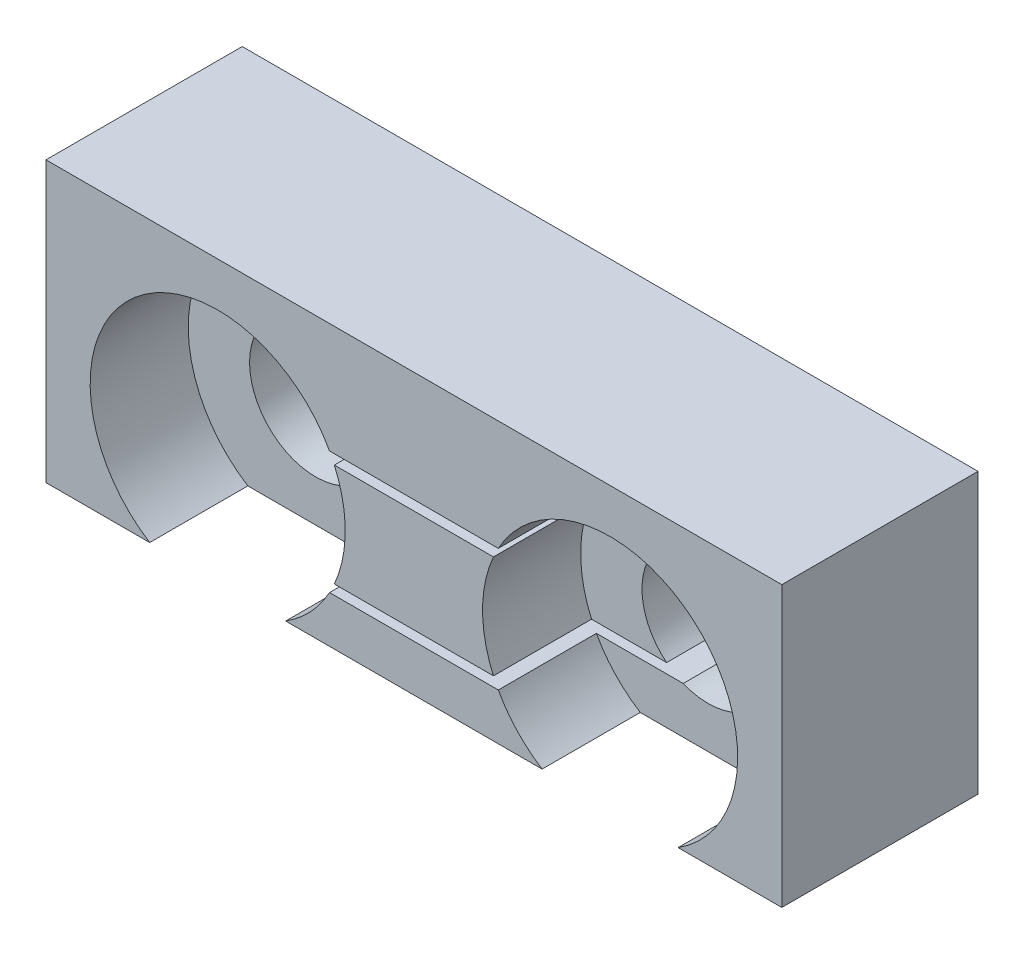
ISO-10303-21;
HEADER;
FILE_DESCRIPTION(('STEP AP214'),'2;1');
FILE_NAME('part.step','',(''),(''),'','','');
FILE_SCHEMA(('AUTOMOTIVE_DESIGN { 1 0 10303 214 1 1 1 1 }'));
ENDSEC;
DATA;
#1=APPLICATION_CONTEXT('core data for automotive mechanical design processes');
#2=APPLICATION_PROTOCOL_DEFINITION('international standard','automotive_design',2000,#1);
#3=PRODUCT_CONTEXT('',#1,'mechanical');
#4=PRODUCT('Part','Part','',(#3));
#5=PRODUCT_RELATED_PRODUCT_CATEGORY('part','',(#4));
#6=PRODUCT_DEFINITION_FORMATION('','',#4);
#7=PRODUCT_DEFINITION_CONTEXT('part definition',#1,'design');
#8=PRODUCT_DEFINITION('design','',#6,#7);
#9=PRODUCT_DEFINITION_SHAPE('','',#8);
#10=(LENGTH_UNIT() NAMED_UNIT(*) SI_UNIT(.MILLI.,.METRE.));
#11=(NAMED_UNIT(*) PLANE_ANGLE_UNIT() SI_UNIT($,.RADIAN.));
#12=(NAMED_UNIT(*) SI_UNIT($,.STERADIAN.) SOLID_ANGLE_UNIT());
#13=UNCERTAINTY_MEASURE_WITH_UNIT(LENGTH_MEASURE(1.E-05),#10,'distance_accuracy_value','');
#14=(GEOMETRIC_REPRESENTATION_CONTEXT(3) GLOBAL_UNCERTAINTY_ASSIGNED_CONTEXT((#13)) GLOBAL_UNIT_ASSIGNED_CONTEXT((#10,
#11,#12)) REPRESENTATION_CONTEXT('',''));
#15=CARTESIAN_POINT('',(0.,0.,0.));
#16=DIRECTION('',(0.,0.,1.));
#17=DIRECTION('',(1.,0.,0.));
#18=AXIS2_PLACEMENT_3D('',#15,#16,#17);
#19=CARTESIAN_POINT('',(0.,0.,40.));
#20=DIRECTION('',(0.,0.,-1.));
#21=DIRECTION('',(-1.,0.,0.));
#22=AXIS2_PLACEMENT_3D('',#19,#20,#21);
#23=PLANE('',#22);
#24=DIRECTION('',(1.,0.,0.));
#25=VECTOR('',#24,1.);
#26=CARTESIAN_POINT('',(-40.,-12.5,40.));
#27=LINE('',#26,#25);
#28=CARTESIAN_POINT('',(-17.201973769644,-12.5,40.));
#29=VERTEX_POINT('',#28);
#30=CARTESIAN_POINT('',(17.201973769644,-12.5,40.));
#31=VERTEX_POINT('',#30);
#32=EDGE_CURVE('E218',#29,#31,#27,.T.);
#33=ORIENTED_EDGE('',*,*,#32,.F.);
#34=CARTESIAN_POINT('',(-40.,0.,40.));
#35=DIRECTION('',(0.,0.,1.));
#36=DIRECTION('',(-1.,0.,0.));
#37=AXIS2_PLACEMENT_3D('',#34,#35,#36);
#38=CIRCLE('',#37,26.);
#39=CARTESIAN_POINT('',(-26.143593539449,-22.,40.));
#40=VERTEX_POINT('',#39);
#41=EDGE_CURVE('E355',#40,#29,#38,.T.);
#42=ORIENTED_EDGE('',*,*,#41,.F.);
#43=DIRECTION('',(-1.,0.,0.));
#44=VECTOR('',#43,1.);
#45=CARTESIAN_POINT('',(-75.,-22.,40.));
#46=LINE('',#45,#44);
#47=CARTESIAN_POINT('',(26.143593539449,-22.,40.));
#48=VERTEX_POINT('',#47);
#49=EDGE_CURVE('E253',#48,#40,#46,.T.);
#50=ORIENTED_EDGE('',*,*,#49,.F.);
#51=CARTESIAN_POINT('',(40.,0.,40.));
#52=DIRECTION('',(0.,0.,1.));
#53=DIRECTION('',(1.,0.,0.));
#54=AXIS2_PLACEMENT_3D('',#51,#52,#53);
#55=CIRCLE('',#54,26.);
#56=EDGE_CURVE('E320',#31,#48,#55,.T.);
#57=ORIENTED_EDGE('',*,*,#56,.F.);
#58=EDGE_LOOP('',(#33,#42,#50,#57));
#59=FACE_BOUND('',#58,.T.);
#60=ADVANCED_FACE('F34',(#59),#23,.F.);
#61=CARTESIAN_POINT('',(40.,0.,20.));
#62=DIRECTION('',(0.,0.,1.));
#63=DIRECTION('',(1.,0.,0.));
#64=AXIS2_PLACEMENT_3D('',#61,#62,#63);
#65=PLANE('',#64);
#66=CARTESIAN_POINT('',(40.,0.,20.));
#67=DIRECTION('',(0.,0.,1.));
#68=DIRECTION('',(1.,0.,0.));
#69=AXIS2_PLACEMENT_3D('',#66,#67,#68);
#70=CIRCLE('',#69,13.5);
#71=CARTESIAN_POINT('',(34.9009804864072,-12.5,20.));
#72=VERTEX_POINT('',#71);
#73=CARTESIAN_POINT('',(34.9009804864072,12.5,20.));
#74=VERTEX_POINT('',#73);
#75=EDGE_CURVE('E699',#72,#74,#70,.T.);
#76=ORIENTED_EDGE('',*,*,#75,.F.);
#77=DIRECTION('',(1.,0.,0.));
#78=VECTOR('',#77,1.);
#79=CARTESIAN_POINT('',(40.,-12.5,20.));
#80=LINE('',#79,#78);
#81=CARTESIAN_POINT('',(17.201973769644,-12.5,20.));
#82=VERTEX_POINT('',#81);
#83=EDGE_CURVE('E216',#82,#72,#80,.T.);
#84=ORIENTED_EDGE('',*,*,#83,.F.);
#85=CARTESIAN_POINT('',(40.,0.,20.));
#86=DIRECTION('',(0.,0.,-1.));
#87=DIRECTION('',(-1.,0.,0.));
#88=AXIS2_PLACEMENT_3D('',#85,#86,#87);
#89=CIRCLE('',#88,26.);
#90=CARTESIAN_POINT('',(26.143593539449,-22.,20.));
#91=VERTEX_POINT('',#90);
#92=EDGE_CURVE('E318',#82,#91,#89,.F.);
#93=ORIENTED_EDGE('',*,*,#92,.T.);
#94=DIRECTION('',(1.,0.,0.));
#95=VECTOR('',#94,1.);
#96=CARTESIAN_POINT('',(-75.,-22.,20.));
#97=LINE('',#96,#95);
#98=CARTESIAN_POINT('',(53.856406460551,-22.,20.));
#99=VERTEX_POINT('',#98);
#100=EDGE_CURVE('E260',#91,#99,#97,.T.);
#101=ORIENTED_EDGE('',*,*,#100,.T.);
#102=CARTESIAN_POINT('',(17.201973769644,12.5,20.));
#103=VERTEX_POINT('',#102);
#104=EDGE_CURVE('E315',#99,#103,#89,.F.);
#105=ORIENTED_EDGE('',*,*,#104,.T.);
#106=DIRECTION('',(-1.,0.,0.));
#107=VECTOR('',#106,1.);
#108=CARTESIAN_POINT('',(40.,12.5,20.));
#109=LINE('',#108,#107);
#110=EDGE_CURVE('E237',#74,#103,#109,.T.);
#111=ORIENTED_EDGE('',*,*,#110,.F.);
#112=EDGE_LOOP('',(#76,#84,#93,#101,#105,#111));
#113=FACE_BOUND('',#112,.T.);
#114=ADVANCED_FACE('F424',(#113),#65,.T.);
#115=CARTESIAN_POINT('',(-40.,0.,20.));
#116=DIRECTION('',(0.,0.,-1.));
#117=DIRECTION('',(-1.,0.,0.));
#118=AXIS2_PLACEMENT_3D('',#115,#116,#117);
#119=PLANE('',#118);
#120=DIRECTION('',(-1.,0.,0.));
#121=VECTOR('',#120,1.);
#122=CARTESIAN_POINT('',(-40.,-12.5,20.));
#123=LINE('',#122,#121);
#124=CARTESIAN_POINT('',(-17.201973769644,-12.5,20.));
#125=VERTEX_POINT('',#124);
#126=CARTESIAN_POINT('',(-34.9009804864072,-12.5,20.));
#127=VERTEX_POINT('',#126);
#128=EDGE_CURVE('E295',#125,#127,#123,.T.);
#129=ORIENTED_EDGE('',*,*,#128,.T.);
#130=CARTESIAN_POINT('',(-40.,0.,20.));
#131=DIRECTION('',(0.,0.,1.));
#132=DIRECTION('',(-1.,0.,0.));
#133=AXIS2_PLACEMENT_3D('',#130,#131,#132);
#134=CIRCLE('',#133,13.5);
#135=CARTESIAN_POINT('',(-34.9009804864072,12.5,20.));
#136=VERTEX_POINT('',#135);
#137=EDGE_CURVE('E684',#136,#127,#134,.T.);
#138=ORIENTED_EDGE('',*,*,#137,.F.);
#139=DIRECTION('',(1.,0.,0.));
#140=VECTOR('',#139,1.);
#141=CARTESIAN_POINT('',(-40.,12.5,20.));
#142=LINE('',#141,#140);
#143=CARTESIAN_POINT('',(-17.201973769644,12.5,20.));
#144=VERTEX_POINT('',#143);
#145=EDGE_CURVE('E235',#136,#144,#142,.T.);
#146=ORIENTED_EDGE('',*,*,#145,.T.);
#147=CARTESIAN_POINT('',(-40.,0.,20.));
#148=DIRECTION('',(0.,0.,-1.));
#149=DIRECTION('',(-1.,0.,0.));
#150=AXIS2_PLACEMENT_3D('',#147,#148,#149);
#151=CIRCLE('',#150,26.);
#152=CARTESIAN_POINT('',(-53.856406460551,-22.,20.));
#153=VERTEX_POINT('',#152);
#154=EDGE_CURVE('E358',#144,#153,#151,.F.);
#155=ORIENTED_EDGE('',*,*,#154,.T.);
#156=DIRECTION('',(-1.,0.,0.));
#157=VECTOR('',#156,1.);
#158=CARTESIAN_POINT('',(-75.,-22.,20.));
#159=LINE('',#158,#157);
#160=CARTESIAN_POINT('',(-26.143593539449,-22.,20.));
#161=VERTEX_POINT('',#160);
#162=EDGE_CURVE('E257',#161,#153,#159,.T.);
#163=ORIENTED_EDGE('',*,*,#162,.F.);
#164=EDGE_CURVE('E366',#161,#125,#151,.F.);
#165=ORIENTED_EDGE('',*,*,#164,.T.);
#166=EDGE_LOOP('',(#129,#138,#146,#155,#163,#165));
#167=FACE_BOUND('',#166,.T.);
#168=ADVANCED_FACE('F429',(#167),#119,.F.);
#169=DIRECTION('',(1.,0.,0.));
#170=VECTOR('',#169,1.);
#171=CARTESIAN_POINT('',(-40.,10.5,40.));
#172=LINE('',#171,#170);
#173=CARTESIAN_POINT('',(-16.2145002154674,10.5,40.));
#174=VERTEX_POINT('',#173);
#175=CARTESIAN_POINT('',(16.2145002154674,10.5,40.));
#176=VERTEX_POINT('',#175);
#177=EDGE_CURVE('E226',#174,#176,#172,.T.);
#178=ORIENTED_EDGE('',*,*,#177,.F.);
#179=CARTESIAN_POINT('',(-16.2145002154674,-10.5,40.));
#180=VERTEX_POINT('',#179);
#181=EDGE_CURVE('E351',#180,#174,#38,.T.);
#182=ORIENTED_EDGE('',*,*,#181,.F.);
#183=DIRECTION('',(-1.,0.,0.));
#184=VECTOR('',#183,1.);
#185=CARTESIAN_POINT('',(-40.,-10.5,40.));
#186=LINE('',#185,#184);
#187=CARTESIAN_POINT('',(16.2145002154674,-10.5,40.));
#188=VERTEX_POINT('',#187);
#189=EDGE_CURVE('E221',#188,#180,#186,.T.);
#190=ORIENTED_EDGE('',*,*,#189,.F.);
#191=EDGE_CURVE('E316',#176,#188,#55,.T.);
#192=ORIENTED_EDGE('',*,*,#191,.F.);
#193=EDGE_LOOP('',(#178,#182,#190,#192));
#194=FACE_BOUND('',#193,.T.);
#195=ADVANCED_FACE('F350',(#194),#23,.F.);
#196=CARTESIAN_POINT('',(40.,0.,-0.001000000000001));
#197=DIRECTION('',(0.,0.,1.));
#198=DIRECTION('',(1.,0.,0.));
#199=AXIS2_PLACEMENT_3D('',#196,#197,#198);
#200=CYLINDRICAL_SURFACE('',#199,2.75);
#201=CARTESIAN_POINT('',(40.,0.,0.));
#202=DIRECTION('',(0.,0.,-1.));
#203=DIRECTION('',(-1.,0.,0.));
#204=AXIS2_PLACEMENT_3D('',#201,#202,#203);
#205=CIRCLE('',#204,2.75);
#206=CARTESIAN_POINT('',(37.25,0.,0.));
#207=VERTEX_POINT('',#206);
#208=EDGE_CURVE('E266',#207,#207,#205,.F.);
#209=ORIENTED_EDGE('',*,*,#208,.F.);
#210=EDGE_LOOP('',(#209));
#211=FACE_BOUND('',#210,.T.);
#212=CARTESIAN_POINT('',(40.,0.,10.));
#213=DIRECTION('',(0.,0.,1.));
#214=DIRECTION('',(1.,0.,0.));
#215=AXIS2_PLACEMENT_3D('',#212,#213,#214);
#216=CIRCLE('',#215,2.75);
#217=CARTESIAN_POINT('',(42.75,0.,10.));
#218=VERTEX_POINT('',#217);
#219=EDGE_CURVE('E267',#218,#218,#216,.F.);
#220=ORIENTED_EDGE('',*,*,#219,.F.);
#221=EDGE_LOOP('',(#220));
#222=FACE_BOUND('',#221,.T.);
#223=ADVANCED_FACE('F416',(#211,#222),#200,.F.);
#224=CARTESIAN_POINT('',(75.,-35.,40.));
#225=DIRECTION('',(-1.,0.,0.));
#226=DIRECTION('',(0.,0.,1.));
#227=AXIS2_PLACEMENT_3D('',#224,#225,#226);
#228=PLANE('',#227);
#229=DIRECTION('',(0.,1.,0.));
#230=VECTOR('',#229,1.);
#231=CARTESIAN_POINT('',(75.,-35.,40.));
#232=LINE('',#231,#230);
#233=CARTESIAN_POINT('',(75.,-22.,40.));
#234=VERTEX_POINT('',#233);
#235=CARTESIAN_POINT('',(75.,35.,40.));
#236=VERTEX_POINT('',#235);
#237=EDGE_CURVE('E271',#234,#236,#232,.T.);
#238=ORIENTED_EDGE('',*,*,#237,.F.);
#239=DIRECTION('',(0.,0.,1.));
#240=VECTOR('',#239,1.);
#241=CARTESIAN_POINT('',(75.,-22.,-0.001000000000001));
#242=LINE('',#241,#240);
#243=CARTESIAN_POINT('',(75.,-22.,0.));
#244=VERTEX_POINT('',#243);
#245=EDGE_CURVE('E252',#244,#234,#242,.T.);
#246=ORIENTED_EDGE('',*,*,#245,.F.);
#247=DIRECTION('',(0.,1.,0.));
#248=VECTOR('',#247,1.);
#249=CARTESIAN_POINT('',(75.,-35.,0.));
#250=LINE('',#249,#248);
#251=CARTESIAN_POINT('',(75.,35.,0.));
#252=VERTEX_POINT('',#251);
#253=EDGE_CURVE('E270',#244,#252,#250,.T.);
#254=ORIENTED_EDGE('',*,*,#253,.T.);
#255=DIRECTION('',(0.,0.,-1.));
#256=VECTOR('',#255,1.);
#257=CARTESIAN_POINT('',(75.,35.,40.));
#258=LINE('',#257,#256);
#259=EDGE_CURVE('E287',#236,#252,#258,.T.);
#260=ORIENTED_EDGE('',*,*,#259,.F.);
#261=EDGE_LOOP('',(#238,#246,#254,#260));
#262=FACE_BOUND('',#261,.T.);
#263=ADVANCED_FACE('F36',(#262),#228,.F.);
#264=CARTESIAN_POINT('',(-75.,35.,40.));
#265=DIRECTION('',(0.,-1.,0.));
#266=DIRECTION('',(0.,0.,-1.));
#267=AXIS2_PLACEMENT_3D('',#264,#265,#266);
#268=PLANE('',#267);
#269=DIRECTION('',(-1.,0.,0.));
#270=VECTOR('',#269,1.);
#271=CARTESIAN_POINT('',(-75.,35.,0.));
#272=LINE('',#271,#270);
#273=CARTESIAN_POINT('',(-75.,35.,0.));
#274=VERTEX_POINT('',#273);
#275=EDGE_CURVE('E281',#252,#274,#272,.T.);
#276=ORIENTED_EDGE('',*,*,#275,.T.);
#277=DIRECTION('',(0.,0.,-1.));
#278=VECTOR('',#277,1.);
#279=CARTESIAN_POINT('',(-75.,35.,40.));
#280=LINE('',#279,#278);
#281=CARTESIAN_POINT('',(-75.,35.,40.));
#282=VERTEX_POINT('',#281);
#283=EDGE_CURVE('E279',#282,#274,#280,.T.);
#284=ORIENTED_EDGE('',*,*,#283,.F.);
#285=DIRECTION('',(-1.,0.,0.));
#286=VECTOR('',#285,1.);
#287=CARTESIAN_POINT('',(-75.,35.,40.));
#288=LINE('',#287,#286);
#289=EDGE_CURVE('E273',#236,#282,#288,.T.);
#290=ORIENTED_EDGE('',*,*,#289,.F.);
#291=ORIENTED_EDGE('',*,*,#259,.T.);
#292=EDGE_LOOP('',(#276,#284,#290,#291));
#293=FACE_BOUND('',#292,.T.);
#294=ADVANCED_FACE('F407',(#293),#268,.F.);
#295=CARTESIAN_POINT('',(-75.,-35.,40.));
#296=DIRECTION('',(1.,0.,0.));
#297=DIRECTION('',(0.,0.,-1.));
#298=AXIS2_PLACEMENT_3D('',#295,#296,#297);
#299=PLANE('',#298);
#300=DIRECTION('',(0.,-1.,0.));
#301=VECTOR('',#300,1.);
#302=CARTESIAN_POINT('',(-75.,-35.,0.));
#303=LINE('',#302,#301);
#304=CARTESIAN_POINT('',(-75.,-22.,0.));
#305=VERTEX_POINT('',#304);
#306=EDGE_CURVE('E274',#274,#305,#303,.T.);
#307=ORIENTED_EDGE('',*,*,#306,.T.);
#308=DIRECTION('',(0.,0.,1.));
#309=VECTOR('',#308,1.);
#310=CARTESIAN_POINT('',(-75.,-22.,-0.001000000000001));
#311=LINE('',#310,#309);
#312=CARTESIAN_POINT('',(-75.,-22.,40.));
#313=VERTEX_POINT('',#312);
#314=EDGE_CURVE('E254',#305,#313,#311,.T.);
#315=ORIENTED_EDGE('',*,*,#314,.T.);
#316=DIRECTION('',(0.,-1.,0.));
#317=VECTOR('',#316,1.);
#318=CARTESIAN_POINT('',(-75.,-35.,40.));
#319=LINE('',#318,#317);
#320=EDGE_CURVE('E276',#282,#313,#319,.T.);
#321=ORIENTED_EDGE('',*,*,#320,.F.);
#322=ORIENTED_EDGE('',*,*,#283,.T.);
#323=EDGE_LOOP('',(#307,#315,#321,#322));
#324=FACE_BOUND('',#323,.T.);
#325=ADVANCED_FACE('F398',(#324),#299,.F.);
#326=CARTESIAN_POINT('',(-53.856406460551,-22.,40.));
#327=VERTEX_POINT('',#326);
#328=EDGE_CURVE('E248',#327,#313,#46,.T.);
#329=ORIENTED_EDGE('',*,*,#328,.F.);
#330=CARTESIAN_POINT('',(-17.201973769644,12.5,40.));
#331=VERTEX_POINT('',#330);
#332=EDGE_CURVE('E356',#331,#327,#38,.T.);
#333=ORIENTED_EDGE('',*,*,#332,.F.);
#334=DIRECTION('',(-1.,0.,0.));
#335=VECTOR('',#334,1.);
#336=CARTESIAN_POINT('',(-40.,12.5,40.));
#337=LINE('',#336,#335);
#338=CARTESIAN_POINT('',(17.201973769644,12.5,40.));
#339=VERTEX_POINT('',#338);
#340=EDGE_CURVE('E227',#339,#331,#337,.T.);
#341=ORIENTED_EDGE('',*,*,#340,.F.);
#342=CARTESIAN_POINT('',(53.856406460551,-22.,40.));
#343=VERTEX_POINT('',#342);
#344=EDGE_CURVE('E322',#343,#339,#55,.T.);
#345=ORIENTED_EDGE('',*,*,#344,.F.);
#346=EDGE_CURVE('E249',#234,#343,#46,.T.);
#347=ORIENTED_EDGE('',*,*,#346,.F.);
#348=ORIENTED_EDGE('',*,*,#237,.T.);
#349=ORIENTED_EDGE('',*,*,#289,.T.);
#350=ORIENTED_EDGE('',*,*,#320,.T.);
#351=EDGE_LOOP('',(#329,#333,#341,#345,#347,#348,#349,#350));
#352=FACE_BOUND('',#351,.T.);
#353=ADVANCED_FACE('F400',(#352),#23,.F.);
#354=CARTESIAN_POINT('',(0.,0.,0.));
#355=DIRECTION('',(0.,0.,-1.));
#356=DIRECTION('',(-1.,0.,0.));
#357=AXIS2_PLACEMENT_3D('',#354,#355,#356);
#358=PLANE('',#357);
#359=DIRECTION('',(-1.,0.,0.));
#360=VECTOR('',#359,1.);
#361=CARTESIAN_POINT('',(-75.,-22.,0.));
#362=LINE('',#361,#360);
#363=EDGE_CURVE('E245',#244,#305,#362,.T.);
#364=ORIENTED_EDGE('',*,*,#363,.T.);
#365=ORIENTED_EDGE('',*,*,#306,.F.);
#366=ORIENTED_EDGE('',*,*,#275,.F.);
#367=ORIENTED_EDGE('',*,*,#253,.F.);
#368=EDGE_LOOP('',(#364,#365,#366,#367));
#369=FACE_BOUND('',#368,.T.);
#370=CARTESIAN_POINT('',(-40.,0.,0.));
#371=DIRECTION('',(0.,0.,-1.));
#372=DIRECTION('',(-1.,0.,0.));
#373=AXIS2_PLACEMENT_3D('',#370,#371,#372);
#374=CIRCLE('',#373,2.75);
#375=CARTESIAN_POINT('',(-42.75,0.,0.));
#376=VERTEX_POINT('',#375);
#377=EDGE_CURVE('E263',#376,#376,#374,.F.);
#378=ORIENTED_EDGE('',*,*,#377,.T.);
#379=EDGE_LOOP('',(#378));
#380=FACE_BOUND('',#379,.T.);
#381=ORIENTED_EDGE('',*,*,#208,.T.);
#382=EDGE_LOOP('',(#381));
#383=FACE_BOUND('',#382,.T.);
#384=ADVANCED_FACE('F410',(#369,#380,#383),#358,.T.);
#385=CARTESIAN_POINT('',(-40.,0.,-0.001000000000001));
#386=DIRECTION('',(0.,0.,1.));
#387=DIRECTION('',(1.,0.,0.));
#388=AXIS2_PLACEMENT_3D('',#385,#386,#387);
#389=CYLINDRICAL_SURFACE('',#388,2.75);
#390=CARTESIAN_POINT('',(-40.,0.,10.));
#391=DIRECTION('',(0.,0.,-1.));
#392=DIRECTION('',(-1.,0.,0.));
#393=AXIS2_PLACEMENT_3D('',#390,#391,#392);
#394=CIRCLE('',#393,2.75);
#395=CARTESIAN_POINT('',(-42.75,0.,10.));
#396=VERTEX_POINT('',#395);
#397=EDGE_CURVE('E262',#396,#396,#394,.F.);
#398=ORIENTED_EDGE('',*,*,#397,.T.);
#399=EDGE_LOOP('',(#398));
#400=FACE_BOUND('',#399,.T.);
#401=ORIENTED_EDGE('',*,*,#377,.F.);
#402=EDGE_LOOP('',(#401));
#403=FACE_BOUND('',#402,.T.);
#404=ADVANCED_FACE('F438',(#400,#403),#389,.F.);
#405=CARTESIAN_POINT('',(40.,0.,10.));
#406=DIRECTION('',(0.,0.,1.));
#407=DIRECTION('',(1.,0.,0.));
#408=AXIS2_PLACEMENT_3D('',#405,#406,#407);
#409=PLANE('',#408);
#410=DIRECTION('',(-1.,0.,0.));
#411=VECTOR('',#410,1.);
#412=CARTESIAN_POINT('',(-40.,12.5,10.));
#413=LINE('',#412,#411);
#414=CARTESIAN_POINT('',(34.9009804864072,12.5,10.));
#415=VERTEX_POINT('',#414);
#416=CARTESIAN_POINT('',(-34.9009804864072,12.5,10.));
#417=VERTEX_POINT('',#416);
#418=EDGE_CURVE('E233',#415,#417,#413,.T.);
#419=ORIENTED_EDGE('',*,*,#418,.T.);
#420=CARTESIAN_POINT('',(-40.,0.,10.));
#421=DIRECTION('',(0.,0.,1.));
#422=DIRECTION('',(1.,0.,0.));
#423=AXIS2_PLACEMENT_3D('',#420,#421,#422);
#424=CIRCLE('',#423,13.5);
#425=CARTESIAN_POINT('',(-34.9009804864072,-12.5,10.));
#426=VERTEX_POINT('',#425);
#427=EDGE_CURVE('E49',#426,#417,#424,.F.);
#428=ORIENTED_EDGE('',*,*,#427,.F.);
#429=DIRECTION('',(1.,0.,0.));
#430=VECTOR('',#429,1.);
#431=CARTESIAN_POINT('',(-40.,-12.5,10.));
#432=LINE('',#431,#430);
#433=CARTESIAN_POINT('',(34.9009804864072,-12.5,10.));
#434=VERTEX_POINT('',#433);
#435=EDGE_CURVE('E214',#426,#434,#432,.T.);
#436=ORIENTED_EDGE('',*,*,#435,.T.);
#437=CARTESIAN_POINT('',(40.,0.,10.));
#438=DIRECTION('',(0.,0.,1.));
#439=DIRECTION('',(1.,0.,0.));
#440=AXIS2_PLACEMENT_3D('',#437,#438,#439);
#441=CIRCLE('',#440,13.5);
#442=EDGE_CURVE('E709',#415,#434,#441,.F.);
#443=ORIENTED_EDGE('',*,*,#442,.F.);
#444=EDGE_LOOP('',(#419,#428,#436,#443));
#445=FACE_BOUND('',#444,.T.);
#446=CARTESIAN_POINT('',(-31.5147186257614,10.5,10.));
#447=VERTEX_POINT('',#446);
#448=CARTESIAN_POINT('',(-31.5147186257614,-10.5,10.));
#449=VERTEX_POINT('',#448);
#450=EDGE_CURVE('E195',#447,#449,#424,.F.);
#451=ORIENTED_EDGE('',*,*,#450,.F.);
#452=DIRECTION('',(1.,0.,0.));
#453=VECTOR('',#452,1.);
#454=CARTESIAN_POINT('',(-40.,10.5,10.));
#455=LINE('',#454,#453);
#456=CARTESIAN_POINT('',(31.5147186257614,10.5,10.));
#457=VERTEX_POINT('',#456);
#458=EDGE_CURVE('E230',#447,#457,#455,.T.);
#459=ORIENTED_EDGE('',*,*,#458,.T.);
#460=CARTESIAN_POINT('',(31.5147186257614,-10.5,10.));
#461=VERTEX_POINT('',#460);
#462=EDGE_CURVE('E57',#461,#457,#441,.F.);
#463=ORIENTED_EDGE('',*,*,#462,.F.);
#464=DIRECTION('',(-1.,0.,0.));
#465=VECTOR('',#464,1.);
#466=CARTESIAN_POINT('',(-40.,-10.5,10.));
#467=LINE('',#466,#465);
#468=EDGE_CURVE('E208',#461,#449,#467,.T.);
#469=ORIENTED_EDGE('',*,*,#468,.T.);
#470=EDGE_LOOP('',(#451,#459,#463,#469));
#471=FACE_BOUND('',#470,.T.);
#472=ORIENTED_EDGE('',*,*,#219,.T.);
#473=EDGE_LOOP('',(#472));
#474=FACE_BOUND('',#473,.T.);
#475=ORIENTED_EDGE('',*,*,#397,.F.);
#476=EDGE_LOOP('',(#475));
#477=FACE_BOUND('',#476,.T.);
#478=ADVANCED_FACE('F211',(#445,#471,#474,#477),#409,.T.);
#479=CARTESIAN_POINT('',(31.5147186257614,10.5,20.));
#480=VERTEX_POINT('',#479);
#481=CARTESIAN_POINT('',(31.5147186257614,-10.5,20.));
#482=VERTEX_POINT('',#481);
#483=EDGE_CURVE('E309',#480,#482,#70,.T.);
#484=ORIENTED_EDGE('',*,*,#483,.F.);
#485=DIRECTION('',(1.,0.,0.));
#486=VECTOR('',#485,1.);
#487=CARTESIAN_POINT('',(40.,10.5,20.));
#488=LINE('',#487,#486);
#489=CARTESIAN_POINT('',(16.2145002154674,10.5,20.));
#490=VERTEX_POINT('',#489);
#491=EDGE_CURVE('E242',#490,#480,#488,.T.);
#492=ORIENTED_EDGE('',*,*,#491,.F.);
#493=CARTESIAN_POINT('',(16.2145002154674,-10.5,20.));
#494=VERTEX_POINT('',#493);
#495=EDGE_CURVE('E311',#490,#494,#89,.F.);
#496=ORIENTED_EDGE('',*,*,#495,.T.);
#497=DIRECTION('',(-1.,0.,0.));
#498=VECTOR('',#497,1.);
#499=CARTESIAN_POINT('',(40.,-10.5,20.));
#500=LINE('',#499,#498);
#501=EDGE_CURVE('E213',#482,#494,#500,.T.);
#502=ORIENTED_EDGE('',*,*,#501,.F.);
#503=EDGE_LOOP('',(#484,#492,#496,#502));
#504=FACE_BOUND('',#503,.T.);
#505=ADVANCED_FACE('F308',(#504),#65,.T.);
#506=DIRECTION('',(-1.,0.,0.));
#507=VECTOR('',#506,1.);
#508=CARTESIAN_POINT('',(-40.,10.5,20.));
#509=LINE('',#508,#507);
#510=CARTESIAN_POINT('',(-16.2145002154674,10.5,20.));
#511=VERTEX_POINT('',#510);
#512=CARTESIAN_POINT('',(-31.5147186257614,10.5,20.));
#513=VERTEX_POINT('',#512);
#514=EDGE_CURVE('E239',#511,#513,#509,.T.);
#515=ORIENTED_EDGE('',*,*,#514,.T.);
#516=CARTESIAN_POINT('',(-31.5147186257614,-10.5,20.));
#517=VERTEX_POINT('',#516);
#518=EDGE_CURVE('E201',#517,#513,#134,.T.);
#519=ORIENTED_EDGE('',*,*,#518,.F.);
#520=DIRECTION('',(1.,0.,0.));
#521=VECTOR('',#520,1.);
#522=CARTESIAN_POINT('',(-40.,-10.5,20.));
#523=LINE('',#522,#521);
#524=CARTESIAN_POINT('',(-16.2145002154674,-10.5,20.));
#525=VERTEX_POINT('',#524);
#526=EDGE_CURVE('E210',#517,#525,#523,.T.);
#527=ORIENTED_EDGE('',*,*,#526,.T.);
#528=EDGE_CURVE('E365',#525,#511,#151,.F.);
#529=ORIENTED_EDGE('',*,*,#528,.T.);
#530=EDGE_LOOP('',(#515,#519,#527,#529));
#531=FACE_BOUND('',#530,.T.);
#532=ADVANCED_FACE('F484',(#531),#119,.F.);
#533=CARTESIAN_POINT('',(-75.,-22.,-0.001000000000001));
#534=DIRECTION('',(0.,1.,0.));
#535=DIRECTION('',(0.,0.,1.));
#536=AXIS2_PLACEMENT_3D('',#533,#534,#535);
#537=PLANE('',#536);
#538=ORIENTED_EDGE('',*,*,#162,.T.);
#539=DIRECTION('',(0.,0.,1.));
#540=VECTOR('',#539,1.);
#541=CARTESIAN_POINT('',(-53.856406460551,-22.,-53.539105243401));
#542=LINE('',#541,#540);
#543=EDGE_CURVE('E377',#153,#327,#542,.T.);
#544=ORIENTED_EDGE('',*,*,#543,.T.);
#545=ORIENTED_EDGE('',*,*,#328,.T.);
#546=ORIENTED_EDGE('',*,*,#314,.F.);
#547=ORIENTED_EDGE('',*,*,#363,.F.);
#548=ORIENTED_EDGE('',*,*,#245,.T.);
#549=ORIENTED_EDGE('',*,*,#346,.T.);
#550=DIRECTION('',(0.,0.,1.));
#551=VECTOR('',#550,1.);
#552=CARTESIAN_POINT('',(53.856406460551,-22.,-53.539105243401));
#553=LINE('',#552,#551);
#554=EDGE_CURVE('E337',#343,#99,#553,.F.);
#555=ORIENTED_EDGE('',*,*,#554,.T.);
#556=ORIENTED_EDGE('',*,*,#100,.F.);
#557=DIRECTION('',(0.,0.,1.));
#558=VECTOR('',#557,1.);
#559=CARTESIAN_POINT('',(26.143593539449,-22.,-53.539105243401));
#560=LINE('',#559,#558);
#561=EDGE_CURVE('E340',#91,#48,#560,.T.);
#562=ORIENTED_EDGE('',*,*,#561,.T.);
#563=ORIENTED_EDGE('',*,*,#49,.T.);
#564=DIRECTION('',(0.,0.,1.));
#565=VECTOR('',#564,1.);
#566=CARTESIAN_POINT('',(-26.143593539449,-22.,-53.539105243401));
#567=LINE('',#566,#565);
#568=EDGE_CURVE('E374',#40,#161,#567,.F.);
#569=ORIENTED_EDGE('',*,*,#568,.T.);
#570=EDGE_LOOP('',(#538,#544,#545,#546,#547,#548,#549,#555,#556,#562,#563,#569));
#571=FACE_BOUND('',#570,.T.);
#572=ADVANCED_FACE('F390',(#571),#537,.F.);
#573=CARTESIAN_POINT('',(-40.,10.5,-70.0249960949702));
#574=DIRECTION('',(0.,-1.,0.));
#575=DIRECTION('',(0.,0.,-1.));
#576=AXIS2_PLACEMENT_3D('',#573,#574,#575);
#577=PLANE('',#576);
#578=ORIENTED_EDGE('',*,*,#458,.F.);
#579=DIRECTION('',(0.,0.,1.));
#580=VECTOR('',#579,1.);
#581=CARTESIAN_POINT('',(-31.5147186257614,10.5,-28.1837661840736));
#582=LINE('',#581,#580);
#583=EDGE_CURVE('E199',#447,#513,#582,.T.);
#584=ORIENTED_EDGE('',*,*,#583,.T.);
#585=ORIENTED_EDGE('',*,*,#514,.F.);
#586=DIRECTION('',(0.,0.,1.));
#587=VECTOR('',#586,1.);
#588=CARTESIAN_POINT('',(-16.2145002154674,10.5,-53.539105243401));
#589=LINE('',#588,#587);
#590=EDGE_CURVE('E372',#511,#174,#589,.T.);
#591=ORIENTED_EDGE('',*,*,#590,.T.);
#592=ORIENTED_EDGE('',*,*,#177,.T.);
#593=DIRECTION('',(0.,0.,1.));
#594=VECTOR('',#593,1.);
#595=CARTESIAN_POINT('',(16.2145002154674,10.5,-53.539105243401));
#596=LINE('',#595,#594);
#597=EDGE_CURVE('E333',#176,#490,#596,.F.);
#598=ORIENTED_EDGE('',*,*,#597,.T.);
#599=ORIENTED_EDGE('',*,*,#491,.T.);
#600=DIRECTION('',(0.,0.,1.));
#601=VECTOR('',#600,1.);
#602=CARTESIAN_POINT('',(31.5147186257614,10.5,-28.1837661840736));
#603=LINE('',#602,#601);
#604=EDGE_CURVE('E359',#480,#457,#603,.F.);
#605=ORIENTED_EDGE('',*,*,#604,.T.);
#606=EDGE_LOOP('',(#578,#584,#585,#591,#592,#598,#599,#605));
#607=FACE_BOUND('',#606,.T.);
#608=ADVANCED_FACE('F498',(#607),#577,.F.);
#609=CARTESIAN_POINT('',(-40.,12.5,-70.0249960949702));
#610=DIRECTION('',(0.,1.,0.));
#611=DIRECTION('',(0.,0.,1.));
#612=AXIS2_PLACEMENT_3D('',#609,#610,#611);
#613=PLANE('',#612);
#614=ORIENTED_EDGE('',*,*,#145,.F.);
#615=DIRECTION('',(0.,0.,1.));
#616=VECTOR('',#615,1.);
#617=CARTESIAN_POINT('',(-34.9009804864072,12.5,-28.1837661840736));
#618=LINE('',#617,#616);
#619=EDGE_CURVE('E694',#136,#417,#618,.F.);
#620=ORIENTED_EDGE('',*,*,#619,.T.);
#621=ORIENTED_EDGE('',*,*,#418,.F.);
#622=DIRECTION('',(0.,0.,1.));
#623=VECTOR('',#622,1.);
#624=CARTESIAN_POINT('',(34.9009804864072,12.5,-28.1837661840736));
#625=LINE('',#624,#623);
#626=EDGE_CURVE('E701',#415,#74,#625,.T.);
#627=ORIENTED_EDGE('',*,*,#626,.T.);
#628=ORIENTED_EDGE('',*,*,#110,.T.);
#629=DIRECTION('',(0.,0.,1.));
#630=VECTOR('',#629,1.);
#631=CARTESIAN_POINT('',(17.201973769644,12.5,-53.539105243401));
#632=LINE('',#631,#630);
#633=EDGE_CURVE('E329',#103,#339,#632,.T.);
#634=ORIENTED_EDGE('',*,*,#633,.T.);
#635=ORIENTED_EDGE('',*,*,#340,.T.);
#636=DIRECTION('',(0.,0.,1.));
#637=VECTOR('',#636,1.);
#638=CARTESIAN_POINT('',(-17.201973769644,12.5,-53.539105243401));
#639=LINE('',#638,#637);
#640=EDGE_CURVE('E369',#331,#144,#639,.F.);
#641=ORIENTED_EDGE('',*,*,#640,.T.);
#642=EDGE_LOOP('',(#614,#620,#621,#627,#628,#634,#635,#641));
#643=FACE_BOUND('',#642,.T.);
#644=ADVANCED_FACE('F505',(#643),#613,.F.);
#645=CARTESIAN_POINT('',(-40.,-12.5,-70.0249960949702));
#646=DIRECTION('',(0.,-1.,0.));
#647=DIRECTION('',(0.,0.,-1.));
#648=AXIS2_PLACEMENT_3D('',#645,#646,#647);
#649=PLANE('',#648);
#650=ORIENTED_EDGE('',*,*,#435,.F.);
#651=DIRECTION('',(0.,0.,1.));
#652=VECTOR('',#651,1.);
#653=CARTESIAN_POINT('',(-34.9009804864072,-12.5,-28.1837661840736));
#654=LINE('',#653,#652);
#655=EDGE_CURVE('E690',#426,#127,#654,.T.);
#656=ORIENTED_EDGE('',*,*,#655,.T.);
#657=ORIENTED_EDGE('',*,*,#128,.F.);
#658=DIRECTION('',(0.,0.,1.));
#659=VECTOR('',#658,1.);
#660=CARTESIAN_POINT('',(-17.201973769644,-12.5,-53.539105243401));
#661=LINE('',#660,#659);
#662=EDGE_CURVE('E367',#125,#29,#661,.T.);
#663=ORIENTED_EDGE('',*,*,#662,.T.);
#664=ORIENTED_EDGE('',*,*,#32,.T.);
#665=DIRECTION('',(0.,0.,1.));
#666=VECTOR('',#665,1.);
#667=CARTESIAN_POINT('',(17.201973769644,-12.5,-53.539105243401));
#668=LINE('',#667,#666);
#669=EDGE_CURVE('E325',#31,#82,#668,.F.);
#670=ORIENTED_EDGE('',*,*,#669,.T.);
#671=ORIENTED_EDGE('',*,*,#83,.T.);
#672=DIRECTION('',(0.,0.,1.));
#673=VECTOR('',#672,1.);
#674=CARTESIAN_POINT('',(34.9009804864072,-12.5,-28.1837661840736));
#675=LINE('',#674,#673);
#676=EDGE_CURVE('E704',#72,#434,#675,.F.);
#677=ORIENTED_EDGE('',*,*,#676,.T.);
#678=EDGE_LOOP('',(#650,#656,#657,#663,#664,#670,#671,#677));
#679=FACE_BOUND('',#678,.T.);
#680=ADVANCED_FACE('F513',(#679),#649,.F.);
#681=CARTESIAN_POINT('',(-40.,-10.5,-70.0249960949702));
#682=DIRECTION('',(0.,1.,0.));
#683=DIRECTION('',(0.,0.,1.));
#684=AXIS2_PLACEMENT_3D('',#681,#682,#683);
#685=PLANE('',#684);
#686=ORIENTED_EDGE('',*,*,#526,.F.);
#687=DIRECTION('',(0.,0.,1.));
#688=VECTOR('',#687,1.);
#689=CARTESIAN_POINT('',(-31.5147186257614,-10.5,-28.1837661840736));
#690=LINE('',#689,#688);
#691=EDGE_CURVE('E12',#517,#449,#690,.F.);
#692=ORIENTED_EDGE('',*,*,#691,.T.);
#693=ORIENTED_EDGE('',*,*,#468,.F.);
#694=DIRECTION('',(0.,0.,1.));
#695=VECTOR('',#694,1.);
#696=CARTESIAN_POINT('',(31.5147186257614,-10.5,-28.1837661840736));
#697=LINE('',#696,#695);
#698=EDGE_CURVE('E42',#461,#482,#697,.T.);
#699=ORIENTED_EDGE('',*,*,#698,.T.);
#700=ORIENTED_EDGE('',*,*,#501,.T.);
#701=DIRECTION('',(0.,0.,1.));
#702=VECTOR('',#701,1.);
#703=CARTESIAN_POINT('',(16.2145002154674,-10.5,-53.539105243401));
#704=LINE('',#703,#702);
#705=EDGE_CURVE('E298',#494,#188,#704,.T.);
#706=ORIENTED_EDGE('',*,*,#705,.T.);
#707=ORIENTED_EDGE('',*,*,#189,.T.);
#708=DIRECTION('',(0.,0.,1.));
#709=VECTOR('',#708,1.);
#710=CARTESIAN_POINT('',(-16.2145002154674,-10.5,-53.539105243401));
#711=LINE('',#710,#709);
#712=EDGE_CURVE('E301',#180,#525,#711,.F.);
#713=ORIENTED_EDGE('',*,*,#712,.T.);
#714=EDGE_LOOP('',(#686,#692,#693,#699,#700,#706,#707,#713));
#715=FACE_BOUND('',#714,.T.);
#716=ADVANCED_FACE('F206',(#715),#685,.F.);
#717=CARTESIAN_POINT('',(40.,0.,-53.539105243401));
#718=DIRECTION('',(0.,0.,1.));
#719=DIRECTION('',(1.,0.,0.));
#720=AXIS2_PLACEMENT_3D('',#717,#718,#719);
#721=CYLINDRICAL_SURFACE('',#720,26.);
#722=ORIENTED_EDGE('',*,*,#191,.T.);
#723=ORIENTED_EDGE('',*,*,#705,.F.);
#724=ORIENTED_EDGE('',*,*,#495,.F.);
#725=ORIENTED_EDGE('',*,*,#597,.F.);
#726=EDGE_LOOP('',(#722,#723,#724,#725));
#727=FACE_BOUND('',#726,.T.);
#728=ADVANCED_FACE('F527',(#727),#721,.F.);
#729=ORIENTED_EDGE('',*,*,#92,.F.);
#730=ORIENTED_EDGE('',*,*,#669,.F.);
#731=ORIENTED_EDGE('',*,*,#56,.T.);
#732=ORIENTED_EDGE('',*,*,#561,.F.);
#733=EDGE_LOOP('',(#729,#730,#731,#732));
#734=FACE_BOUND('',#733,.T.);
#735=ADVANCED_FACE('F385',(#734),#721,.F.);
#736=ORIENTED_EDGE('',*,*,#344,.T.);
#737=ORIENTED_EDGE('',*,*,#633,.F.);
#738=ORIENTED_EDGE('',*,*,#104,.F.);
#739=ORIENTED_EDGE('',*,*,#554,.F.);
#740=EDGE_LOOP('',(#736,#737,#738,#739));
#741=FACE_BOUND('',#740,.T.);
#742=ADVANCED_FACE('F535',(#741),#721,.F.);
#743=CARTESIAN_POINT('',(-40.,0.,-53.539105243401));
#744=DIRECTION('',(0.,0.,1.));
#745=DIRECTION('',(1.,0.,0.));
#746=AXIS2_PLACEMENT_3D('',#743,#744,#745);
#747=CYLINDRICAL_SURFACE('',#746,26.);
#748=ORIENTED_EDGE('',*,*,#528,.F.);
#749=ORIENTED_EDGE('',*,*,#712,.F.);
#750=ORIENTED_EDGE('',*,*,#181,.T.);
#751=ORIENTED_EDGE('',*,*,#590,.F.);
#752=EDGE_LOOP('',(#748,#749,#750,#751));
#753=FACE_BOUND('',#752,.T.);
#754=ADVANCED_FACE('F546',(#753),#747,.F.);
#755=ORIENTED_EDGE('',*,*,#41,.T.);
#756=ORIENTED_EDGE('',*,*,#662,.F.);
#757=ORIENTED_EDGE('',*,*,#164,.F.);
#758=ORIENTED_EDGE('',*,*,#568,.F.);
#759=EDGE_LOOP('',(#755,#756,#757,#758));
#760=FACE_BOUND('',#759,.T.);
#761=ADVANCED_FACE('F552',(#760),#747,.F.);
#762=ORIENTED_EDGE('',*,*,#154,.F.);
#763=ORIENTED_EDGE('',*,*,#640,.F.);
#764=ORIENTED_EDGE('',*,*,#332,.T.);
#765=ORIENTED_EDGE('',*,*,#543,.F.);
#766=EDGE_LOOP('',(#762,#763,#764,#765));
#767=FACE_BOUND('',#766,.T.);
#768=ADVANCED_FACE('F554',(#767),#747,.F.);
#769=CARTESIAN_POINT('',(40.,0.,-28.1837661840736));
#770=DIRECTION('',(0.,0.,1.));
#771=DIRECTION('',(1.,0.,0.));
#772=AXIS2_PLACEMENT_3D('',#769,#770,#771);
#773=CYLINDRICAL_SURFACE('',#772,13.5);
#774=ORIENTED_EDGE('',*,*,#483,.T.);
#775=ORIENTED_EDGE('',*,*,#698,.F.);
#776=ORIENTED_EDGE('',*,*,#462,.T.);
#777=ORIENTED_EDGE('',*,*,#604,.F.);
#778=EDGE_LOOP('',(#774,#775,#776,#777));
#779=FACE_BOUND('',#778,.T.);
#780=ADVANCED_FACE('F566',(#779),#773,.F.);
#781=ORIENTED_EDGE('',*,*,#442,.T.);
#782=ORIENTED_EDGE('',*,*,#676,.F.);
#783=ORIENTED_EDGE('',*,*,#75,.T.);
#784=ORIENTED_EDGE('',*,*,#626,.F.);
#785=EDGE_LOOP('',(#781,#782,#783,#784));
#786=FACE_BOUND('',#785,.T.);
#787=ADVANCED_FACE('F573',(#786),#773,.F.);
#788=CARTESIAN_POINT('',(-40.,0.,-28.1837661840736));
#789=DIRECTION('',(0.,0.,1.));
#790=DIRECTION('',(1.,0.,0.));
#791=AXIS2_PLACEMENT_3D('',#788,#789,#790);
#792=CYLINDRICAL_SURFACE('',#791,13.5);
#793=ORIENTED_EDGE('',*,*,#450,.T.);
#794=ORIENTED_EDGE('',*,*,#691,.F.);
#795=ORIENTED_EDGE('',*,*,#518,.T.);
#796=ORIENTED_EDGE('',*,*,#583,.F.);
#797=EDGE_LOOP('',(#793,#794,#795,#796));
#798=FACE_BOUND('',#797,.T.);
#799=ADVANCED_FACE('F196',(#798),#792,.F.);
#800=ORIENTED_EDGE('',*,*,#137,.T.);
#801=ORIENTED_EDGE('',*,*,#655,.F.);
#802=ORIENTED_EDGE('',*,*,#427,.T.);
#803=ORIENTED_EDGE('',*,*,#619,.F.);
#804=EDGE_LOOP('',(#800,#801,#802,#803));
#805=FACE_BOUND('',#804,.T.);
#806=ADVANCED_FACE('F586',(#805),#792,.F.);
#807=CLOSED_SHELL('',(#60,#114,#168,#195,#223,#263,#294,#325,#353,#384,#404,#478,#505,#532,#572,
#608,#644,#680,#716,#728,#735,#742,#754,#761,#768,#780,#787,#799,#806));
#808=MANIFOLD_SOLID_BREP('B2',#807);
#809=ADVANCED_BREP_SHAPE_REPRESENTATION('',(#18,#808),#14);
#810=SHAPE_DEFINITION_REPRESENTATION(#9,#809);
ENDSEC;
END-ISO-10303-21;
